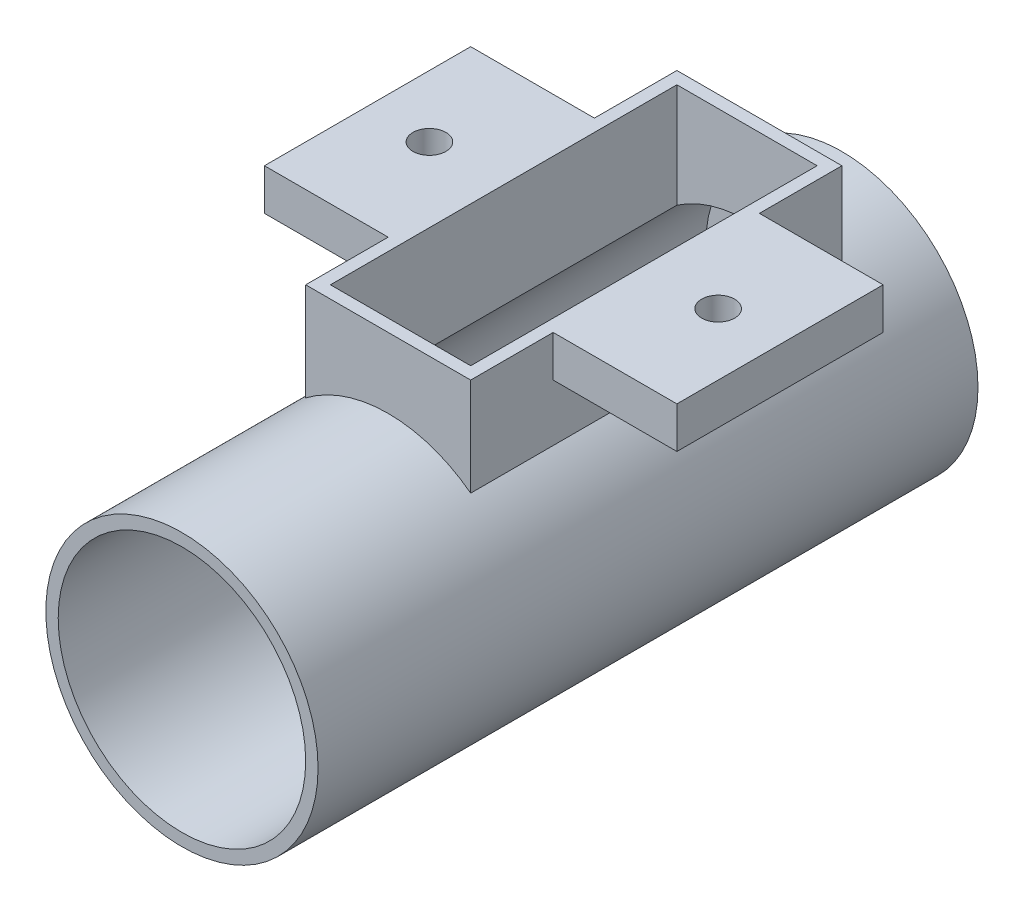
ISO-10303-21;
HEADER;
FILE_DESCRIPTION(('STEP AP214'),'2;1');
FILE_NAME('part.step','',(''),(''),'','','');
FILE_SCHEMA(('AUTOMOTIVE_DESIGN { 1 0 10303 214 1 1 1 1 }'));
ENDSEC;
DATA;
#1=APPLICATION_CONTEXT('core data for automotive mechanical design processes');
#2=APPLICATION_PROTOCOL_DEFINITION('international standard','automotive_design',2000,#1);
#3=PRODUCT_CONTEXT('',#1,'mechanical');
#4=PRODUCT('Part','Part','',(#3));
#5=PRODUCT_RELATED_PRODUCT_CATEGORY('part','',(#4));
#6=PRODUCT_DEFINITION_FORMATION('','',#4);
#7=PRODUCT_DEFINITION_CONTEXT('part definition',#1,'design');
#8=PRODUCT_DEFINITION('design','',#6,#7);
#9=PRODUCT_DEFINITION_SHAPE('','',#8);
#10=(LENGTH_UNIT() NAMED_UNIT(*) SI_UNIT(.MILLI.,.METRE.));
#11=(NAMED_UNIT(*) PLANE_ANGLE_UNIT() SI_UNIT($,.RADIAN.));
#12=(NAMED_UNIT(*) SI_UNIT($,.STERADIAN.) SOLID_ANGLE_UNIT());
#13=UNCERTAINTY_MEASURE_WITH_UNIT(LENGTH_MEASURE(1.E-05),#10,'distance_accuracy_value','');
#14=(GEOMETRIC_REPRESENTATION_CONTEXT(3) GLOBAL_UNCERTAINTY_ASSIGNED_CONTEXT((#13)) GLOBAL_UNIT_ASSIGNED_CONTEXT((#10,
#11,#12)) REPRESENTATION_CONTEXT('',''));
#15=CARTESIAN_POINT('',(0.,0.,0.));
#16=DIRECTION('',(0.,0.,1.));
#17=DIRECTION('',(1.,0.,0.));
#18=AXIS2_PLACEMENT_3D('',#15,#16,#17);
#19=CARTESIAN_POINT('',(20.,-33.002,20.));
#20=DIRECTION('',(1.,0.,0.));
#21=DIRECTION('',(0.,0.,-1.));
#22=AXIS2_PLACEMENT_3D('',#19,#20,#21);
#23=PLANE('',#22);
#24=DIRECTION('',(0.,0.,-1.));
#25=VECTOR('',#24,1.);
#26=CARTESIAN_POINT('',(20.,50.,20.));
#27=LINE('',#26,#25);
#28=CARTESIAN_POINT('',(20.,50.,40.));
#29=VERTEX_POINT('',#28);
#30=CARTESIAN_POINT('',(20.,50.,20.));
#31=VERTEX_POINT('',#30);
#32=EDGE_CURVE('E274',#29,#31,#27,.T.);
#33=ORIENTED_EDGE('',*,*,#32,.F.);
#34=DIRECTION('',(0.,1.,0.));
#35=VECTOR('',#34,1.);
#36=CARTESIAN_POINT('',(20.,50.,40.));
#37=LINE('',#36,#35);
#38=CARTESIAN_POINT('',(20.,40.,40.));
#39=VERTEX_POINT('',#38);
#40=EDGE_CURVE('E180',#39,#29,#37,.T.);
#41=ORIENTED_EDGE('',*,*,#40,.F.);
#42=DIRECTION('',(0.,0.,-1.));
#43=VECTOR('',#42,1.);
#44=CARTESIAN_POINT('',(20.,40.,90.));
#45=LINE('',#44,#43);
#46=CARTESIAN_POINT('',(20.,40.,90.));
#47=VERTEX_POINT('',#46);
#48=EDGE_CURVE('E176',#47,#39,#45,.T.);
#49=ORIENTED_EDGE('',*,*,#48,.F.);
#50=DIRECTION('',(0.,-1.,0.));
#51=VECTOR('',#50,1.);
#52=CARTESIAN_POINT('',(20.,50.,90.));
#53=LINE('',#52,#51);
#54=CARTESIAN_POINT('',(20.,50.,90.));
#55=VERTEX_POINT('',#54);
#56=EDGE_CURVE('E334',#55,#47,#53,.T.);
#57=ORIENTED_EDGE('',*,*,#56,.F.);
#58=CARTESIAN_POINT('',(20.,50.,110.));
#59=VERTEX_POINT('',#58);
#60=EDGE_CURVE('E270',#59,#55,#27,.T.);
#61=ORIENTED_EDGE('',*,*,#60,.F.);
#62=DIRECTION('',(0.,1.,0.));
#63=VECTOR('',#62,1.);
#64=CARTESIAN_POINT('',(20.,-33.002,110.));
#65=LINE('',#64,#63);
#66=CARTESIAN_POINT('',(20.,26.2488094968134,110.));
#67=VERTEX_POINT('',#66);
#68=EDGE_CURVE('E280',#67,#59,#65,.T.);
#69=ORIENTED_EDGE('',*,*,#68,.F.);
#70=DIRECTION('',(0.,0.,-1.));
#71=VECTOR('',#70,1.);
#72=CARTESIAN_POINT('',(20.,26.2488094968134,160.));
#73=LINE('',#72,#71);
#74=CARTESIAN_POINT('',(20.,26.2488094968134,20.));
#75=VERTEX_POINT('',#74);
#76=EDGE_CURVE('E269',#67,#75,#73,.T.);
#77=ORIENTED_EDGE('',*,*,#76,.T.);
#78=DIRECTION('',(0.,1.,0.));
#79=VECTOR('',#78,1.);
#80=CARTESIAN_POINT('',(20.,-33.002,20.));
#81=LINE('',#80,#79);
#82=EDGE_CURVE('E292',#75,#31,#81,.T.);
#83=ORIENTED_EDGE('',*,*,#82,.T.);
#84=EDGE_LOOP('',(#33,#41,#49,#57,#61,#69,#77,#83));
#85=FACE_BOUND('',#84,.T.);
#86=ADVANCED_FACE('F38',(#85),#23,.T.);
#87=CARTESIAN_POINT('',(-20.,-33.002,20.));
#88=DIRECTION('',(-1.,0.,0.));
#89=DIRECTION('',(0.,0.,1.));
#90=AXIS2_PLACEMENT_3D('',#87,#88,#89);
#91=PLANE('',#90);
#92=DIRECTION('',(0.,0.,1.));
#93=VECTOR('',#92,1.);
#94=CARTESIAN_POINT('',(-20.,50.,20.));
#95=LINE('',#94,#93);
#96=CARTESIAN_POINT('',(-20.,50.,90.));
#97=VERTEX_POINT('',#96);
#98=CARTESIAN_POINT('',(-20.,50.,110.));
#99=VERTEX_POINT('',#98);
#100=EDGE_CURVE('E279',#97,#99,#95,.T.);
#101=ORIENTED_EDGE('',*,*,#100,.F.);
#102=DIRECTION('',(0.,1.,0.));
#103=VECTOR('',#102,1.);
#104=CARTESIAN_POINT('',(-20.,50.,90.));
#105=LINE('',#104,#103);
#106=CARTESIAN_POINT('',(-20.,40.,90.));
#107=VERTEX_POINT('',#106);
#108=EDGE_CURVE('E208',#107,#97,#105,.T.);
#109=ORIENTED_EDGE('',*,*,#108,.F.);
#110=DIRECTION('',(0.,0.,1.));
#111=VECTOR('',#110,1.);
#112=CARTESIAN_POINT('',(-20.,40.,40.));
#113=LINE('',#112,#111);
#114=CARTESIAN_POINT('',(-20.,40.,40.));
#115=VERTEX_POINT('',#114);
#116=EDGE_CURVE('E198',#115,#107,#113,.T.);
#117=ORIENTED_EDGE('',*,*,#116,.F.);
#118=DIRECTION('',(0.,-1.,0.));
#119=VECTOR('',#118,1.);
#120=CARTESIAN_POINT('',(-20.,50.,40.));
#121=LINE('',#120,#119);
#122=CARTESIAN_POINT('',(-20.,50.,40.));
#123=VERTEX_POINT('',#122);
#124=EDGE_CURVE('E212',#123,#115,#121,.T.);
#125=ORIENTED_EDGE('',*,*,#124,.F.);
#126=CARTESIAN_POINT('',(-20.,50.,20.));
#127=VERTEX_POINT('',#126);
#128=EDGE_CURVE('E281',#127,#123,#95,.T.);
#129=ORIENTED_EDGE('',*,*,#128,.F.);
#130=DIRECTION('',(0.,1.,0.));
#131=VECTOR('',#130,1.);
#132=CARTESIAN_POINT('',(-20.,-33.002,20.));
#133=LINE('',#132,#131);
#134=CARTESIAN_POINT('',(-20.,26.2488094968134,20.));
#135=VERTEX_POINT('',#134);
#136=EDGE_CURVE('E306',#135,#127,#133,.T.);
#137=ORIENTED_EDGE('',*,*,#136,.F.);
#138=DIRECTION('',(0.,0.,-1.));
#139=VECTOR('',#138,1.);
#140=CARTESIAN_POINT('',(-20.,26.2488094968134,160.));
#141=LINE('',#140,#139);
#142=CARTESIAN_POINT('',(-20.,26.2488094968134,110.));
#143=VERTEX_POINT('',#142);
#144=EDGE_CURVE('E293',#135,#143,#141,.F.);
#145=ORIENTED_EDGE('',*,*,#144,.T.);
#146=DIRECTION('',(0.,1.,0.));
#147=VECTOR('',#146,1.);
#148=CARTESIAN_POINT('',(-20.,-33.002,110.));
#149=LINE('',#148,#147);
#150=EDGE_CURVE('E302',#143,#99,#149,.T.);
#151=ORIENTED_EDGE('',*,*,#150,.T.);
#152=EDGE_LOOP('',(#101,#109,#117,#125,#129,#137,#145,#151));
#153=FACE_BOUND('',#152,.T.);
#154=ADVANCED_FACE('F369',(#153),#91,.T.);
#155=CARTESIAN_POINT('',(0.,0.,160.));
#156=DIRECTION('',(0.,0.,-1.));
#157=DIRECTION('',(-1.,0.,0.));
#158=AXIS2_PLACEMENT_3D('',#155,#156,#157);
#159=CYLINDRICAL_SURFACE('',#158,33.);
#160=ORIENTED_EDGE('',*,*,#144,.F.);
#161=CARTESIAN_POINT('',(0.,0.,20.));
#162=DIRECTION('',(0.,0.,-1.));
#163=DIRECTION('',(-1.,0.,0.));
#164=AXIS2_PLACEMENT_3D('',#161,#162,#163);
#165=CIRCLE('',#164,33.);
#166=EDGE_CURVE('E297',#75,#135,#165,.F.);
#167=ORIENTED_EDGE('',*,*,#166,.F.);
#168=ORIENTED_EDGE('',*,*,#76,.F.);
#169=CARTESIAN_POINT('',(0.,0.,110.));
#170=DIRECTION('',(0.,0.,1.));
#171=DIRECTION('',(1.,0.,0.));
#172=AXIS2_PLACEMENT_3D('',#169,#170,#171);
#173=CIRCLE('',#172,33.);
#174=EDGE_CURVE('E289',#143,#67,#173,.F.);
#175=ORIENTED_EDGE('',*,*,#174,.F.);
#176=EDGE_LOOP('',(#160,#167,#168,#175));
#177=FACE_BOUND('',#176,.T.);
#178=CARTESIAN_POINT('',(0.,0.,160.));
#179=DIRECTION('',(0.,0.,1.));
#180=DIRECTION('',(1.,0.,0.));
#181=AXIS2_PLACEMENT_3D('',#178,#179,#180);
#182=CIRCLE('',#181,33.);
#183=CARTESIAN_POINT('',(33.,0.,160.));
#184=VERTEX_POINT('',#183);
#185=EDGE_CURVE('E11',#184,#184,#182,.T.);
#186=ORIENTED_EDGE('',*,*,#185,.F.);
#187=EDGE_LOOP('',(#186));
#188=FACE_BOUND('',#187,.T.);
#189=CARTESIAN_POINT('',(0.,0.,0.));
#190=DIRECTION('',(0.,0.,1.));
#191=DIRECTION('',(1.,0.,0.));
#192=AXIS2_PLACEMENT_3D('',#189,#190,#191);
#193=CIRCLE('',#192,33.);
#194=CARTESIAN_POINT('',(33.,0.,0.));
#195=VERTEX_POINT('',#194);
#196=EDGE_CURVE('E48',#195,#195,#193,.T.);
#197=ORIENTED_EDGE('',*,*,#196,.T.);
#198=EDGE_LOOP('',(#197));
#199=FACE_BOUND('',#198,.T.);
#200=ADVANCED_FACE('F40',(#177,#188,#199),#159,.T.);
#201=CARTESIAN_POINT('',(0.,0.,160.));
#202=DIRECTION('',(0.,0.,1.));
#203=DIRECTION('',(1.,0.,0.));
#204=AXIS2_PLACEMENT_3D('',#201,#202,#203);
#205=PLANE('',#204);
#206=CARTESIAN_POINT('',(0.,0.,160.));
#207=DIRECTION('',(0.,0.,1.));
#208=DIRECTION('',(1.,0.,0.));
#209=AXIS2_PLACEMENT_3D('',#206,#207,#208);
#210=CIRCLE('',#209,30.);
#211=CARTESIAN_POINT('',(30.,0.,160.));
#212=VERTEX_POINT('',#211);
#213=EDGE_CURVE('E317',#212,#212,#210,.T.);
#214=ORIENTED_EDGE('',*,*,#213,.F.);
#215=EDGE_LOOP('',(#214));
#216=FACE_BOUND('',#215,.T.);
#217=ORIENTED_EDGE('',*,*,#185,.T.);
#218=EDGE_LOOP('',(#217));
#219=FACE_BOUND('',#218,.T.);
#220=ADVANCED_FACE('F424',(#216,#219),#205,.T.);
#221=CARTESIAN_POINT('',(0.,0.,0.));
#222=DIRECTION('',(0.,0.,1.));
#223=DIRECTION('',(1.,0.,0.));
#224=AXIS2_PLACEMENT_3D('',#221,#222,#223);
#225=PLANE('',#224);
#226=CARTESIAN_POINT('',(0.,0.,0.));
#227=DIRECTION('',(0.,0.,-1.));
#228=DIRECTION('',(-1.,0.,0.));
#229=AXIS2_PLACEMENT_3D('',#226,#227,#228);
#230=CIRCLE('',#229,3.75);
#231=CARTESIAN_POINT('',(-3.75,0.,0.));
#232=VERTEX_POINT('',#231);
#233=EDGE_CURVE('E342',#232,#232,#230,.T.);
#234=ORIENTED_EDGE('',*,*,#233,.F.);
#235=EDGE_LOOP('',(#234));
#236=FACE_BOUND('',#235,.T.);
#237=ORIENTED_EDGE('',*,*,#196,.F.);
#238=EDGE_LOOP('',(#237));
#239=FACE_BOUND('',#238,.T.);
#240=ADVANCED_FACE('F419',(#236,#239),#225,.F.);
#241=CARTESIAN_POINT('',(0.,0.,160.));
#242=DIRECTION('',(0.,0.,-1.));
#243=DIRECTION('',(-1.,0.,0.));
#244=AXIS2_PLACEMENT_3D('',#241,#242,#243);
#245=CYLINDRICAL_SURFACE('',#244,30.);
#246=DIRECTION('',(0.,0.,-1.));
#247=VECTOR('',#246,1.);
#248=CARTESIAN_POINT('',(17.,24.7184141886165,160.));
#249=LINE('',#248,#247);
#250=CARTESIAN_POINT('',(17.,24.7184141886165,23.));
#251=VERTEX_POINT('',#250);
#252=CARTESIAN_POINT('',(17.,24.7184141886165,107.));
#253=VERTEX_POINT('',#252);
#254=EDGE_CURVE('E266',#251,#253,#249,.F.);
#255=ORIENTED_EDGE('',*,*,#254,.F.);
#256=CARTESIAN_POINT('',(0.,0.,23.));
#257=DIRECTION('',(0.,0.,-1.));
#258=DIRECTION('',(-1.,0.,0.));
#259=AXIS2_PLACEMENT_3D('',#256,#257,#258);
#260=CIRCLE('',#259,30.);
#261=CARTESIAN_POINT('',(-17.,24.7184141886165,23.));
#262=VERTEX_POINT('',#261);
#263=EDGE_CURVE('E247',#262,#251,#260,.T.);
#264=ORIENTED_EDGE('',*,*,#263,.F.);
#265=DIRECTION('',(0.,0.,-1.));
#266=VECTOR('',#265,1.);
#267=CARTESIAN_POINT('',(-17.,24.7184141886166,160.));
#268=LINE('',#267,#266);
#269=CARTESIAN_POINT('',(-17.,24.7184141886165,107.));
#270=VERTEX_POINT('',#269);
#271=EDGE_CURVE('E259',#270,#262,#268,.T.);
#272=ORIENTED_EDGE('',*,*,#271,.F.);
#273=CARTESIAN_POINT('',(0.,0.,107.));
#274=DIRECTION('',(0.,0.,1.));
#275=DIRECTION('',(1.,0.,0.));
#276=AXIS2_PLACEMENT_3D('',#273,#274,#275);
#277=CIRCLE('',#276,30.);
#278=EDGE_CURVE('E263',#253,#270,#277,.T.);
#279=ORIENTED_EDGE('',*,*,#278,.F.);
#280=EDGE_LOOP('',(#255,#264,#272,#279));
#281=FACE_BOUND('',#280,.T.);
#282=ORIENTED_EDGE('',*,*,#213,.T.);
#283=EDGE_LOOP('',(#282));
#284=FACE_BOUND('',#283,.T.);
#285=CARTESIAN_POINT('',(0.,0.,3.));
#286=DIRECTION('',(0.,0.,1.));
#287=DIRECTION('',(1.,0.,0.));
#288=AXIS2_PLACEMENT_3D('',#285,#286,#287);
#289=CIRCLE('',#288,30.);
#290=CARTESIAN_POINT('',(30.,0.,3.));
#291=VERTEX_POINT('',#290);
#292=EDGE_CURVE('E273',#291,#291,#289,.T.);
#293=ORIENTED_EDGE('',*,*,#292,.F.);
#294=EDGE_LOOP('',(#293));
#295=FACE_BOUND('',#294,.T.);
#296=ADVANCED_FACE('F415',(#281,#284,#295),#245,.F.);
#297=CARTESIAN_POINT('',(0.,0.,3.));
#298=DIRECTION('',(0.,0.,1.));
#299=DIRECTION('',(1.,0.,0.));
#300=AXIS2_PLACEMENT_3D('',#297,#298,#299);
#301=PLANE('',#300);
#302=CARTESIAN_POINT('',(0.,0.,3.));
#303=DIRECTION('',(0.,0.,1.));
#304=DIRECTION('',(1.,0.,0.));
#305=AXIS2_PLACEMENT_3D('',#302,#303,#304);
#306=CIRCLE('',#305,3.75);
#307=CARTESIAN_POINT('',(3.75,0.,3.));
#308=VERTEX_POINT('',#307);
#309=EDGE_CURVE('E42',#308,#308,#306,.T.);
#310=ORIENTED_EDGE('',*,*,#309,.F.);
#311=EDGE_LOOP('',(#310));
#312=FACE_BOUND('',#311,.T.);
#313=ORIENTED_EDGE('',*,*,#292,.T.);
#314=EDGE_LOOP('',(#313));
#315=FACE_BOUND('',#314,.T.);
#316=ADVANCED_FACE('F418',(#312,#315),#301,.T.);
#317=CARTESIAN_POINT('',(-20.,-33.002,20.));
#318=DIRECTION('',(0.,0.,-1.));
#319=DIRECTION('',(-1.,0.,0.));
#320=AXIS2_PLACEMENT_3D('',#317,#318,#319);
#321=PLANE('',#320);
#322=ORIENTED_EDGE('',*,*,#82,.F.);
#323=ORIENTED_EDGE('',*,*,#166,.T.);
#324=ORIENTED_EDGE('',*,*,#136,.T.);
#325=DIRECTION('',(-1.,0.,0.));
#326=VECTOR('',#325,1.);
#327=CARTESIAN_POINT('',(-20.,50.,20.));
#328=LINE('',#327,#326);
#329=EDGE_CURVE('E275',#31,#127,#328,.T.);
#330=ORIENTED_EDGE('',*,*,#329,.F.);
#331=EDGE_LOOP('',(#322,#323,#324,#330));
#332=FACE_BOUND('',#331,.T.);
#333=ADVANCED_FACE('F381',(#332),#321,.T.);
#334=CARTESIAN_POINT('',(0.,50.,0.));
#335=DIRECTION('',(0.,1.,0.));
#336=DIRECTION('',(0.,0.,1.));
#337=AXIS2_PLACEMENT_3D('',#334,#335,#336);
#338=PLANE('',#337);
#339=CARTESIAN_POINT('',(35.,50.,65.));
#340=DIRECTION('',(0.,1.,0.));
#341=DIRECTION('',(0.,0.,1.));
#342=AXIS2_PLACEMENT_3D('',#339,#340,#341);
#343=CIRCLE('',#342,4.00000000000001);
#344=CARTESIAN_POINT('',(35.,50.,69.));
#345=VERTEX_POINT('',#344);
#346=EDGE_CURVE('E329',#345,#345,#343,.T.);
#347=ORIENTED_EDGE('',*,*,#346,.F.);
#348=EDGE_LOOP('',(#347));
#349=FACE_BOUND('',#348,.T.);
#350=CARTESIAN_POINT('',(-35.,50.,65.));
#351=DIRECTION('',(0.,1.,0.));
#352=DIRECTION('',(0.,0.,1.));
#353=AXIS2_PLACEMENT_3D('',#350,#351,#352);
#354=CIRCLE('',#353,4.);
#355=CARTESIAN_POINT('',(-35.,50.,69.));
#356=VERTEX_POINT('',#355);
#357=EDGE_CURVE('E183',#356,#356,#354,.T.);
#358=ORIENTED_EDGE('',*,*,#357,.F.);
#359=EDGE_LOOP('',(#358));
#360=FACE_BOUND('',#359,.T.);
#361=DIRECTION('',(0.,0.,-1.));
#362=VECTOR('',#361,1.);
#363=CARTESIAN_POINT('',(17.,50.,23.));
#364=LINE('',#363,#362);
#365=CARTESIAN_POINT('',(17.,50.,107.));
#366=VERTEX_POINT('',#365);
#367=CARTESIAN_POINT('',(17.,50.,23.));
#368=VERTEX_POINT('',#367);
#369=EDGE_CURVE('E228',#366,#368,#364,.T.);
#370=ORIENTED_EDGE('',*,*,#369,.F.);
#371=DIRECTION('',(1.,0.,0.));
#372=VECTOR('',#371,1.);
#373=CARTESIAN_POINT('',(-17.,50.,107.));
#374=LINE('',#373,#372);
#375=CARTESIAN_POINT('',(-17.,50.,107.));
#376=VERTEX_POINT('',#375);
#377=EDGE_CURVE('E239',#376,#366,#374,.T.);
#378=ORIENTED_EDGE('',*,*,#377,.F.);
#379=DIRECTION('',(0.,0.,1.));
#380=VECTOR('',#379,1.);
#381=CARTESIAN_POINT('',(-17.,50.,23.));
#382=LINE('',#381,#380);
#383=CARTESIAN_POINT('',(-17.,50.,23.));
#384=VERTEX_POINT('',#383);
#385=EDGE_CURVE('E235',#384,#376,#382,.T.);
#386=ORIENTED_EDGE('',*,*,#385,.F.);
#387=DIRECTION('',(-1.,0.,0.));
#388=VECTOR('',#387,1.);
#389=CARTESIAN_POINT('',(-17.,50.,23.));
#390=LINE('',#389,#388);
#391=EDGE_CURVE('E231',#368,#384,#390,.T.);
#392=ORIENTED_EDGE('',*,*,#391,.F.);
#393=EDGE_LOOP('',(#370,#378,#386,#392));
#394=FACE_BOUND('',#393,.T.);
#395=ORIENTED_EDGE('',*,*,#60,.T.);
#396=DIRECTION('',(-1.,0.,0.));
#397=VECTOR('',#396,1.);
#398=CARTESIAN_POINT('',(50.,50.,90.));
#399=LINE('',#398,#397);
#400=CARTESIAN_POINT('',(50.,50.,90.));
#401=VERTEX_POINT('',#400);
#402=EDGE_CURVE('E162',#401,#55,#399,.T.);
#403=ORIENTED_EDGE('',*,*,#402,.F.);
#404=DIRECTION('',(0.,0.,1.));
#405=VECTOR('',#404,1.);
#406=CARTESIAN_POINT('',(50.,50.,90.));
#407=LINE('',#406,#405);
#408=CARTESIAN_POINT('',(50.,50.,40.));
#409=VERTEX_POINT('',#408);
#410=EDGE_CURVE('E155',#409,#401,#407,.T.);
#411=ORIENTED_EDGE('',*,*,#410,.F.);
#412=DIRECTION('',(-1.,0.,0.));
#413=VECTOR('',#412,1.);
#414=CARTESIAN_POINT('',(50.,50.,40.));
#415=LINE('',#414,#413);
#416=EDGE_CURVE('E160',#409,#29,#415,.T.);
#417=ORIENTED_EDGE('',*,*,#416,.T.);
#418=ORIENTED_EDGE('',*,*,#32,.T.);
#419=ORIENTED_EDGE('',*,*,#329,.T.);
#420=ORIENTED_EDGE('',*,*,#128,.T.);
#421=DIRECTION('',(1.,0.,0.));
#422=VECTOR('',#421,1.);
#423=CARTESIAN_POINT('',(-50.,50.,40.));
#424=LINE('',#423,#422);
#425=CARTESIAN_POINT('',(-50.,50.,40.));
#426=VERTEX_POINT('',#425);
#427=EDGE_CURVE('E222',#426,#123,#424,.T.);
#428=ORIENTED_EDGE('',*,*,#427,.F.);
#429=DIRECTION('',(0.,0.,-1.));
#430=VECTOR('',#429,1.);
#431=CARTESIAN_POINT('',(-50.,50.,40.));
#432=LINE('',#431,#430);
#433=CARTESIAN_POINT('',(-50.,50.,90.));
#434=VERTEX_POINT('',#433);
#435=EDGE_CURVE('E197',#434,#426,#432,.T.);
#436=ORIENTED_EDGE('',*,*,#435,.F.);
#437=DIRECTION('',(1.,0.,0.));
#438=VECTOR('',#437,1.);
#439=CARTESIAN_POINT('',(-50.,50.,90.));
#440=LINE('',#439,#438);
#441=EDGE_CURVE('E225',#434,#97,#440,.T.);
#442=ORIENTED_EDGE('',*,*,#441,.T.);
#443=ORIENTED_EDGE('',*,*,#100,.T.);
#444=DIRECTION('',(1.,0.,0.));
#445=VECTOR('',#444,1.);
#446=CARTESIAN_POINT('',(-20.,50.,110.));
#447=LINE('',#446,#445);
#448=EDGE_CURVE('E285',#99,#59,#447,.T.);
#449=ORIENTED_EDGE('',*,*,#448,.T.);
#450=EDGE_LOOP('',(#395,#403,#411,#417,#418,#419,#420,#428,#436,#442,#443,#449));
#451=FACE_BOUND('',#450,.T.);
#452=ADVANCED_FACE('F158',(#349,#360,#394,#451),#338,.T.);
#453=CARTESIAN_POINT('',(-20.,-33.002,110.));
#454=DIRECTION('',(0.,0.,1.));
#455=DIRECTION('',(1.,0.,0.));
#456=AXIS2_PLACEMENT_3D('',#453,#454,#455);
#457=PLANE('',#456);
#458=ORIENTED_EDGE('',*,*,#150,.F.);
#459=ORIENTED_EDGE('',*,*,#174,.T.);
#460=ORIENTED_EDGE('',*,*,#68,.T.);
#461=ORIENTED_EDGE('',*,*,#448,.F.);
#462=EDGE_LOOP('',(#458,#459,#460,#461));
#463=FACE_BOUND('',#462,.T.);
#464=ADVANCED_FACE('F374',(#463),#457,.T.);
#465=CARTESIAN_POINT('',(17.,-9.99999999999991,23.));
#466=DIRECTION('',(1.,0.,0.));
#467=DIRECTION('',(0.,0.,-1.));
#468=AXIS2_PLACEMENT_3D('',#465,#466,#467);
#469=PLANE('',#468);
#470=ORIENTED_EDGE('',*,*,#254,.T.);
#471=DIRECTION('',(0.,1.,0.));
#472=VECTOR('',#471,1.);
#473=CARTESIAN_POINT('',(17.,-9.99999999999991,107.));
#474=LINE('',#473,#472);
#475=EDGE_CURVE('E244',#253,#366,#474,.T.);
#476=ORIENTED_EDGE('',*,*,#475,.T.);
#477=ORIENTED_EDGE('',*,*,#369,.T.);
#478=DIRECTION('',(0.,1.,0.));
#479=VECTOR('',#478,1.);
#480=CARTESIAN_POINT('',(17.,-9.99999999999991,23.));
#481=LINE('',#480,#479);
#482=EDGE_CURVE('E243',#251,#368,#481,.T.);
#483=ORIENTED_EDGE('',*,*,#482,.F.);
#484=EDGE_LOOP('',(#470,#476,#477,#483));
#485=FACE_BOUND('',#484,.T.);
#486=ADVANCED_FACE('F470',(#485),#469,.F.);
#487=CARTESIAN_POINT('',(-17.,-9.99999999999991,107.));
#488=DIRECTION('',(0.,0.,1.));
#489=DIRECTION('',(1.,0.,0.));
#490=AXIS2_PLACEMENT_3D('',#487,#488,#489);
#491=PLANE('',#490);
#492=ORIENTED_EDGE('',*,*,#278,.T.);
#493=DIRECTION('',(0.,1.,0.));
#494=VECTOR('',#493,1.);
#495=CARTESIAN_POINT('',(-17.,-9.99999999999991,107.));
#496=LINE('',#495,#494);
#497=EDGE_CURVE('E248',#270,#376,#496,.T.);
#498=ORIENTED_EDGE('',*,*,#497,.T.);
#499=ORIENTED_EDGE('',*,*,#377,.T.);
#500=ORIENTED_EDGE('',*,*,#475,.F.);
#501=EDGE_LOOP('',(#492,#498,#499,#500));
#502=FACE_BOUND('',#501,.T.);
#503=ADVANCED_FACE('F487',(#502),#491,.F.);
#504=CARTESIAN_POINT('',(-17.,-9.99999999999991,23.));
#505=DIRECTION('',(-1.,0.,0.));
#506=DIRECTION('',(0.,0.,1.));
#507=AXIS2_PLACEMENT_3D('',#504,#505,#506);
#508=PLANE('',#507);
#509=ORIENTED_EDGE('',*,*,#271,.T.);
#510=DIRECTION('',(0.,1.,0.));
#511=VECTOR('',#510,1.);
#512=CARTESIAN_POINT('',(-17.,-9.99999999999991,23.));
#513=LINE('',#512,#511);
#514=EDGE_CURVE('E251',#262,#384,#513,.T.);
#515=ORIENTED_EDGE('',*,*,#514,.T.);
#516=ORIENTED_EDGE('',*,*,#385,.T.);
#517=ORIENTED_EDGE('',*,*,#497,.F.);
#518=EDGE_LOOP('',(#509,#515,#516,#517));
#519=FACE_BOUND('',#518,.T.);
#520=ADVANCED_FACE('F495',(#519),#508,.F.);
#521=CARTESIAN_POINT('',(-17.,-9.99999999999991,23.));
#522=DIRECTION('',(0.,0.,-1.));
#523=DIRECTION('',(-1.,0.,0.));
#524=AXIS2_PLACEMENT_3D('',#521,#522,#523);
#525=PLANE('',#524);
#526=ORIENTED_EDGE('',*,*,#263,.T.);
#527=ORIENTED_EDGE('',*,*,#482,.T.);
#528=ORIENTED_EDGE('',*,*,#391,.T.);
#529=ORIENTED_EDGE('',*,*,#514,.F.);
#530=EDGE_LOOP('',(#526,#527,#528,#529));
#531=FACE_BOUND('',#530,.T.);
#532=ADVANCED_FACE('F503',(#531),#525,.F.);
#533=CARTESIAN_POINT('',(-50.,50.,90.));
#534=DIRECTION('',(0.,0.,-1.));
#535=DIRECTION('',(-1.,0.,0.));
#536=AXIS2_PLACEMENT_3D('',#533,#534,#535);
#537=PLANE('',#536);
#538=ORIENTED_EDGE('',*,*,#108,.T.);
#539=ORIENTED_EDGE('',*,*,#441,.F.);
#540=DIRECTION('',(0.,1.,0.));
#541=VECTOR('',#540,1.);
#542=CARTESIAN_POINT('',(-50.,50.,90.));
#543=LINE('',#542,#541);
#544=CARTESIAN_POINT('',(-50.,40.,90.));
#545=VERTEX_POINT('',#544);
#546=EDGE_CURVE('E193',#545,#434,#543,.T.);
#547=ORIENTED_EDGE('',*,*,#546,.F.);
#548=DIRECTION('',(1.,0.,0.));
#549=VECTOR('',#548,1.);
#550=CARTESIAN_POINT('',(-50.,40.,90.));
#551=LINE('',#550,#549);
#552=EDGE_CURVE('E207',#545,#107,#551,.T.);
#553=ORIENTED_EDGE('',*,*,#552,.T.);
#554=EDGE_LOOP('',(#538,#539,#547,#553));
#555=FACE_BOUND('',#554,.T.);
#556=ADVANCED_FACE('F394',(#555),#537,.F.);
#557=CARTESIAN_POINT('',(-50.,50.,40.));
#558=DIRECTION('',(0.,0.,1.));
#559=DIRECTION('',(1.,0.,0.));
#560=AXIS2_PLACEMENT_3D('',#557,#558,#559);
#561=PLANE('',#560);
#562=ORIENTED_EDGE('',*,*,#124,.T.);
#563=DIRECTION('',(1.,0.,0.));
#564=VECTOR('',#563,1.);
#565=CARTESIAN_POINT('',(-50.,40.,40.));
#566=LINE('',#565,#564);
#567=CARTESIAN_POINT('',(-50.,40.,40.));
#568=VERTEX_POINT('',#567);
#569=EDGE_CURVE('E64',#568,#115,#566,.T.);
#570=ORIENTED_EDGE('',*,*,#569,.F.);
#571=DIRECTION('',(0.,-1.,0.));
#572=VECTOR('',#571,1.);
#573=CARTESIAN_POINT('',(-50.,50.,40.));
#574=LINE('',#573,#572);
#575=EDGE_CURVE('E201',#426,#568,#574,.T.);
#576=ORIENTED_EDGE('',*,*,#575,.F.);
#577=ORIENTED_EDGE('',*,*,#427,.T.);
#578=EDGE_LOOP('',(#562,#570,#576,#577));
#579=FACE_BOUND('',#578,.T.);
#580=ADVANCED_FACE('F388',(#579),#561,.F.);
#581=CARTESIAN_POINT('',(-50.,40.,40.));
#582=DIRECTION('',(0.,1.,0.));
#583=DIRECTION('',(0.,0.,1.));
#584=AXIS2_PLACEMENT_3D('',#581,#582,#583);
#585=PLANE('',#584);
#586=CARTESIAN_POINT('',(-35.,40.,65.));
#587=DIRECTION('',(0.,1.,0.));
#588=DIRECTION('',(0.,0.,1.));
#589=AXIS2_PLACEMENT_3D('',#586,#587,#588);
#590=CIRCLE('',#589,4.);
#591=CARTESIAN_POINT('',(-35.,40.,69.));
#592=VERTEX_POINT('',#591);
#593=EDGE_CURVE('E188',#592,#592,#590,.T.);
#594=ORIENTED_EDGE('',*,*,#593,.T.);
#595=EDGE_LOOP('',(#594));
#596=FACE_BOUND('',#595,.T.);
#597=ORIENTED_EDGE('',*,*,#116,.T.);
#598=ORIENTED_EDGE('',*,*,#552,.F.);
#599=DIRECTION('',(0.,0.,1.));
#600=VECTOR('',#599,1.);
#601=CARTESIAN_POINT('',(-50.,40.,40.));
#602=LINE('',#601,#600);
#603=EDGE_CURVE('E204',#568,#545,#602,.T.);
#604=ORIENTED_EDGE('',*,*,#603,.F.);
#605=ORIENTED_EDGE('',*,*,#569,.T.);
#606=EDGE_LOOP('',(#597,#598,#604,#605));
#607=FACE_BOUND('',#606,.T.);
#608=ADVANCED_FACE('F395',(#596,#607),#585,.F.);
#609=CARTESIAN_POINT('',(-50.,0.,0.));
#610=DIRECTION('',(-1.,0.,0.));
#611=DIRECTION('',(0.,0.,1.));
#612=AXIS2_PLACEMENT_3D('',#609,#610,#611);
#613=PLANE('',#612);
#614=ORIENTED_EDGE('',*,*,#546,.T.);
#615=ORIENTED_EDGE('',*,*,#435,.T.);
#616=ORIENTED_EDGE('',*,*,#575,.T.);
#617=ORIENTED_EDGE('',*,*,#603,.T.);
#618=EDGE_LOOP('',(#614,#615,#616,#617));
#619=FACE_BOUND('',#618,.T.);
#620=ADVANCED_FACE('F390',(#619),#613,.T.);
#621=CARTESIAN_POINT('',(-35.,20.,65.));
#622=DIRECTION('',(0.,1.,0.));
#623=DIRECTION('',(0.,0.,1.));
#624=AXIS2_PLACEMENT_3D('',#621,#622,#623);
#625=CYLINDRICAL_SURFACE('',#624,4.);
#626=ORIENTED_EDGE('',*,*,#357,.T.);
#627=EDGE_LOOP('',(#626));
#628=FACE_BOUND('',#627,.T.);
#629=ORIENTED_EDGE('',*,*,#593,.F.);
#630=EDGE_LOOP('',(#629));
#631=FACE_BOUND('',#630,.T.);
#632=ADVANCED_FACE('F403',(#628,#631),#625,.F.);
#633=CARTESIAN_POINT('',(50.,50.,40.));
#634=DIRECTION('',(0.,0.,1.));
#635=DIRECTION('',(1.,0.,0.));
#636=AXIS2_PLACEMENT_3D('',#633,#634,#635);
#637=PLANE('',#636);
#638=ORIENTED_EDGE('',*,*,#40,.T.);
#639=ORIENTED_EDGE('',*,*,#416,.F.);
#640=DIRECTION('',(0.,1.,0.));
#641=VECTOR('',#640,1.);
#642=CARTESIAN_POINT('',(50.,50.,40.));
#643=LINE('',#642,#641);
#644=CARTESIAN_POINT('',(50.,40.,40.));
#645=VERTEX_POINT('',#644);
#646=EDGE_CURVE('E167',#645,#409,#643,.T.);
#647=ORIENTED_EDGE('',*,*,#646,.F.);
#648=DIRECTION('',(-1.,0.,0.));
#649=VECTOR('',#648,1.);
#650=CARTESIAN_POINT('',(50.,40.,40.));
#651=LINE('',#650,#649);
#652=EDGE_CURVE('E348',#645,#39,#651,.T.);
#653=ORIENTED_EDGE('',*,*,#652,.T.);
#654=EDGE_LOOP('',(#638,#639,#647,#653));
#655=FACE_BOUND('',#654,.T.);
#656=ADVANCED_FACE('F178',(#655),#637,.F.);
#657=CARTESIAN_POINT('',(50.,50.,90.));
#658=DIRECTION('',(0.,0.,-1.));
#659=DIRECTION('',(-1.,0.,0.));
#660=AXIS2_PLACEMENT_3D('',#657,#658,#659);
#661=PLANE('',#660);
#662=ORIENTED_EDGE('',*,*,#56,.T.);
#663=DIRECTION('',(-1.,0.,0.));
#664=VECTOR('',#663,1.);
#665=CARTESIAN_POINT('',(50.,40.,90.));
#666=LINE('',#665,#664);
#667=CARTESIAN_POINT('',(50.,40.,90.));
#668=VERTEX_POINT('',#667);
#669=EDGE_CURVE('E56',#668,#47,#666,.T.);
#670=ORIENTED_EDGE('',*,*,#669,.F.);
#671=DIRECTION('',(0.,-1.,0.));
#672=VECTOR('',#671,1.);
#673=CARTESIAN_POINT('',(50.,50.,90.));
#674=LINE('',#673,#672);
#675=EDGE_CURVE('E166',#401,#668,#674,.T.);
#676=ORIENTED_EDGE('',*,*,#675,.F.);
#677=ORIENTED_EDGE('',*,*,#402,.T.);
#678=EDGE_LOOP('',(#662,#670,#676,#677));
#679=FACE_BOUND('',#678,.T.);
#680=ADVANCED_FACE('F554',(#679),#661,.F.);
#681=CARTESIAN_POINT('',(50.,40.,90.));
#682=DIRECTION('',(0.,1.,0.));
#683=DIRECTION('',(0.,0.,1.));
#684=AXIS2_PLACEMENT_3D('',#681,#682,#683);
#685=PLANE('',#684);
#686=CARTESIAN_POINT('',(35.,40.,65.));
#687=DIRECTION('',(0.,1.,0.));
#688=DIRECTION('',(0.,0.,1.));
#689=AXIS2_PLACEMENT_3D('',#686,#687,#688);
#690=CIRCLE('',#689,4.00000000000001);
#691=CARTESIAN_POINT('',(35.,40.,69.));
#692=VERTEX_POINT('',#691);
#693=EDGE_CURVE('E326',#692,#692,#690,.T.);
#694=ORIENTED_EDGE('',*,*,#693,.T.);
#695=EDGE_LOOP('',(#694));
#696=FACE_BOUND('',#695,.T.);
#697=ORIENTED_EDGE('',*,*,#48,.T.);
#698=ORIENTED_EDGE('',*,*,#652,.F.);
#699=DIRECTION('',(0.,0.,-1.));
#700=VECTOR('',#699,1.);
#701=CARTESIAN_POINT('',(50.,40.,90.));
#702=LINE('',#701,#700);
#703=EDGE_CURVE('E171',#668,#645,#702,.T.);
#704=ORIENTED_EDGE('',*,*,#703,.F.);
#705=ORIENTED_EDGE('',*,*,#669,.T.);
#706=EDGE_LOOP('',(#697,#698,#704,#705));
#707=FACE_BOUND('',#706,.T.);
#708=ADVANCED_FACE('F562',(#696,#707),#685,.F.);
#709=CARTESIAN_POINT('',(50.,0.,0.));
#710=DIRECTION('',(1.,0.,0.));
#711=DIRECTION('',(0.,0.,-1.));
#712=AXIS2_PLACEMENT_3D('',#709,#710,#711);
#713=PLANE('',#712);
#714=ORIENTED_EDGE('',*,*,#646,.T.);
#715=ORIENTED_EDGE('',*,*,#410,.T.);
#716=ORIENTED_EDGE('',*,*,#675,.T.);
#717=ORIENTED_EDGE('',*,*,#703,.T.);
#718=EDGE_LOOP('',(#714,#715,#716,#717));
#719=FACE_BOUND('',#718,.T.);
#720=ADVANCED_FACE('F170',(#719),#713,.T.);
#721=CARTESIAN_POINT('',(35.,20.,65.));
#722=DIRECTION('',(0.,1.,0.));
#723=DIRECTION('',(0.,0.,1.));
#724=AXIS2_PLACEMENT_3D('',#721,#722,#723);
#725=CYLINDRICAL_SURFACE('',#724,4.00000000000001);
#726=ORIENTED_EDGE('',*,*,#346,.T.);
#727=EDGE_LOOP('',(#726));
#728=FACE_BOUND('',#727,.T.);
#729=ORIENTED_EDGE('',*,*,#693,.F.);
#730=EDGE_LOOP('',(#729));
#731=FACE_BOUND('',#730,.T.);
#732=ADVANCED_FACE('F573',(#728,#731),#725,.F.);
#733=CARTESIAN_POINT('',(0.,0.,10.));
#734=DIRECTION('',(0.,0.,-1.));
#735=DIRECTION('',(-1.,0.,0.));
#736=AXIS2_PLACEMENT_3D('',#733,#734,#735);
#737=CYLINDRICAL_SURFACE('',#736,3.75);
#738=ORIENTED_EDGE('',*,*,#309,.T.);
#739=EDGE_LOOP('',(#738));
#740=FACE_BOUND('',#739,.T.);
#741=ORIENTED_EDGE('',*,*,#233,.T.);
#742=EDGE_LOOP('',(#741));
#743=FACE_BOUND('',#742,.T.);
#744=ADVANCED_FACE('F583',(#740,#743),#737,.F.);
#745=CLOSED_SHELL('',(#86,#154,#200,#220,#240,#296,#316,#333,#452,#464,#486,#503,#520,#532,#556,
#580,#608,#620,#632,#656,#680,#708,#720,#732,#744));
#746=MANIFOLD_SOLID_BREP('B2',#745);
#747=ADVANCED_BREP_SHAPE_REPRESENTATION('',(#18,#746),#14);
#748=SHAPE_DEFINITION_REPRESENTATION(#9,#747);
ENDSEC;
END-ISO-10303-21;
